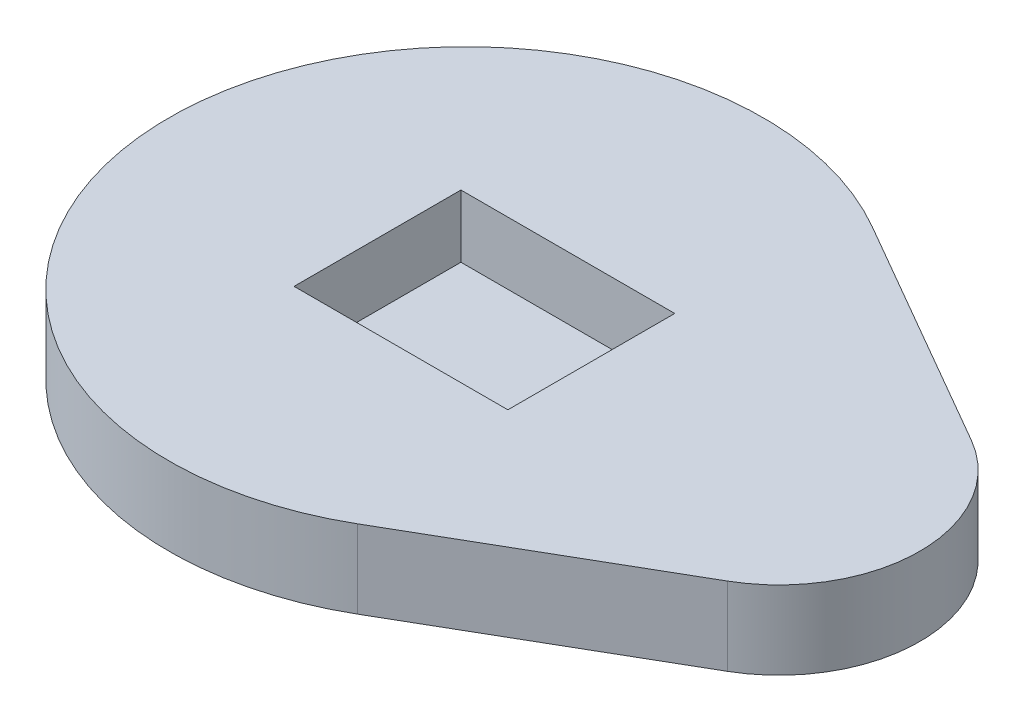
ISO-10303-21;
HEADER;
FILE_DESCRIPTION(('STEP AP214'),'2;1');
FILE_NAME('part.step','',(''),(''),'','','');
FILE_SCHEMA(('AUTOMOTIVE_DESIGN { 1 0 10303 214 1 1 1 1 }'));
ENDSEC;
DATA;
#1=APPLICATION_CONTEXT('core data for automotive mechanical design processes');
#2=APPLICATION_PROTOCOL_DEFINITION('international standard','automotive_design',2000,#1);
#3=PRODUCT_CONTEXT('',#1,'mechanical');
#4=PRODUCT('Part','Part','',(#3));
#5=PRODUCT_RELATED_PRODUCT_CATEGORY('part','',(#4));
#6=PRODUCT_DEFINITION_FORMATION('','',#4);
#7=PRODUCT_DEFINITION_CONTEXT('part definition',#1,'design');
#8=PRODUCT_DEFINITION('design','',#6,#7);
#9=PRODUCT_DEFINITION_SHAPE('','',#8);
#10=(LENGTH_UNIT() NAMED_UNIT(*) SI_UNIT(.MILLI.,.METRE.));
#11=(NAMED_UNIT(*) PLANE_ANGLE_UNIT() SI_UNIT($,.RADIAN.));
#12=(NAMED_UNIT(*) SI_UNIT($,.STERADIAN.) SOLID_ANGLE_UNIT());
#13=UNCERTAINTY_MEASURE_WITH_UNIT(LENGTH_MEASURE(1.E-05),#10,'distance_accuracy_value','');
#14=(GEOMETRIC_REPRESENTATION_CONTEXT(3) GLOBAL_UNCERTAINTY_ASSIGNED_CONTEXT((#13)) GLOBAL_UNIT_ASSIGNED_CONTEXT((#10,
#11,#12)) REPRESENTATION_CONTEXT('',''));
#15=CARTESIAN_POINT('',(0.,0.,0.));
#16=DIRECTION('',(0.,0.,1.));
#17=DIRECTION('',(1.,0.,0.));
#18=AXIS2_PLACEMENT_3D('',#15,#16,#17);
#19=CARTESIAN_POINT('',(-14.999999999992,15.,2.27750893168553E-12));
#20=DIRECTION('',(0.,-1.,0.));
#21=DIRECTION('',(0.,0.,-1.));
#22=AXIS2_PLACEMENT_3D('',#19,#20,#21);
#23=CYLINDRICAL_SURFACE('',#22,56.9999999999957);
#24=CARTESIAN_POINT('',(-14.999999999992,0.,2.27750893168553E-12));
#25=DIRECTION('',(0.,1.,0.));
#26=DIRECTION('',(0.,0.,1.));
#27=AXIS2_PLACEMENT_3D('',#24,#25,#26);
#28=CIRCLE('',#27,56.9999999999957);
#29=CARTESIAN_POINT('',(13.5000000000058,0.,-49.363448015707));
#30=VERTEX_POINT('',#29);
#31=CARTESIAN_POINT('',(13.5000000000058,0.,49.3634480157116));
#32=VERTEX_POINT('',#31);
#33=EDGE_CURVE('E158',#30,#32,#28,.T.);
#34=ORIENTED_EDGE('',*,*,#33,.T.);
#35=DIRECTION('',(0.,-1.,0.));
#36=VECTOR('',#35,1.);
#37=CARTESIAN_POINT('',(13.5000000000058,15.,49.3634480157116));
#38=LINE('',#37,#36);
#39=CARTESIAN_POINT('',(13.5000000000058,15.,49.3634480157116));
#40=VERTEX_POINT('',#39);
#41=EDGE_CURVE('E11',#40,#32,#38,.T.);
#42=ORIENTED_EDGE('',*,*,#41,.F.);
#43=CARTESIAN_POINT('',(-14.999999999992,15.,2.27750893168553E-12));
#44=DIRECTION('',(0.,1.,0.));
#45=DIRECTION('',(0.,0.,1.));
#46=AXIS2_PLACEMENT_3D('',#43,#44,#45);
#47=CIRCLE('',#46,56.9999999999957);
#48=CARTESIAN_POINT('',(13.5000000000058,15.,-49.363448015707));
#49=VERTEX_POINT('',#48);
#50=EDGE_CURVE('E164',#49,#40,#47,.T.);
#51=ORIENTED_EDGE('',*,*,#50,.F.);
#52=DIRECTION('',(0.,-1.,0.));
#53=VECTOR('',#52,1.);
#54=CARTESIAN_POINT('',(13.5000000000058,15.,-49.363448015707));
#55=LINE('',#54,#53);
#56=EDGE_CURVE('E174',#49,#30,#55,.T.);
#57=ORIENTED_EDGE('',*,*,#56,.T.);
#58=EDGE_LOOP('',(#34,#42,#51,#57));
#59=FACE_BOUND('',#58,.T.);
#60=ADVANCED_FACE('F39',(#59),#23,.T.);
#61=CARTESIAN_POINT('',(13.5000000000058,15.,49.3634480157116));
#62=DIRECTION('',(-0.5,0.,-0.866025403784438));
#63=DIRECTION('',(-0.866025403784439,0.,0.5));
#64=AXIS2_PLACEMENT_3D('',#61,#62,#63);
#65=PLANE('',#64);
#66=DIRECTION('',(0.866025403784439,0.,-0.5));
#67=VECTOR('',#66,1.);
#68=CARTESIAN_POINT('',(13.5000000000058,0.,49.3634480157116));
#69=LINE('',#68,#67);
#70=CARTESIAN_POINT('',(58.499999997785,0.,23.3826859034606));
#71=VERTEX_POINT('',#70);
#72=EDGE_CURVE('E178',#32,#71,#69,.T.);
#73=ORIENTED_EDGE('',*,*,#72,.T.);
#74=DIRECTION('',(0.,-1.,0.));
#75=VECTOR('',#74,1.);
#76=CARTESIAN_POINT('',(58.499999997785,15.,23.3826859034606));
#77=LINE('',#76,#75);
#78=CARTESIAN_POINT('',(58.499999997785,15.,23.3826859034606));
#79=VERTEX_POINT('',#78);
#80=EDGE_CURVE('E47',#79,#71,#77,.T.);
#81=ORIENTED_EDGE('',*,*,#80,.F.);
#82=DIRECTION('',(0.866025403784439,0.,-0.5));
#83=VECTOR('',#82,1.);
#84=CARTESIAN_POINT('',(13.5000000000058,15.,49.3634480157116));
#85=LINE('',#84,#83);
#86=EDGE_CURVE('E91',#40,#79,#85,.T.);
#87=ORIENTED_EDGE('',*,*,#86,.F.);
#88=ORIENTED_EDGE('',*,*,#41,.T.);
#89=EDGE_LOOP('',(#73,#81,#87,#88));
#90=FACE_BOUND('',#89,.T.);
#91=ADVANCED_FACE('F213',(#90),#65,.F.);
#92=CARTESIAN_POINT('',(44.9999999970469,15.,2.27192763023602E-12));
#93=DIRECTION('',(0.,-1.,0.));
#94=DIRECTION('',(0.,0.,-1.));
#95=AXIS2_PLACEMENT_3D('',#92,#93,#94);
#96=CYLINDRICAL_SURFACE('',#95,27.0000000014763);
#97=CARTESIAN_POINT('',(44.9999999970469,0.,2.27192763023602E-12));
#98=DIRECTION('',(0.,1.,0.));
#99=DIRECTION('',(0.,0.,-1.));
#100=AXIS2_PLACEMENT_3D('',#97,#98,#99);
#101=CIRCLE('',#100,27.0000000014763);
#102=CARTESIAN_POINT('',(58.499999997785,0.,-23.382685903456));
#103=VERTEX_POINT('',#102);
#104=EDGE_CURVE('E181',#71,#103,#101,.T.);
#105=ORIENTED_EDGE('',*,*,#104,.T.);
#106=DIRECTION('',(0.,-1.,0.));
#107=VECTOR('',#106,1.);
#108=CARTESIAN_POINT('',(58.499999997785,15.,-23.382685903456));
#109=LINE('',#108,#107);
#110=CARTESIAN_POINT('',(58.499999997785,15.,-23.382685903456));
#111=VERTEX_POINT('',#110);
#112=EDGE_CURVE('E188',#111,#103,#109,.T.);
#113=ORIENTED_EDGE('',*,*,#112,.F.);
#114=CARTESIAN_POINT('',(44.9999999970469,15.,2.27192763023602E-12));
#115=DIRECTION('',(0.,1.,0.));
#116=DIRECTION('',(0.,0.,-1.));
#117=AXIS2_PLACEMENT_3D('',#114,#115,#116);
#118=CIRCLE('',#117,27.0000000014763);
#119=EDGE_CURVE('E169',#79,#111,#118,.T.);
#120=ORIENTED_EDGE('',*,*,#119,.F.);
#121=ORIENTED_EDGE('',*,*,#80,.T.);
#122=EDGE_LOOP('',(#105,#113,#120,#121));
#123=FACE_BOUND('',#122,.T.);
#124=ADVANCED_FACE('F195',(#123),#96,.T.);
#125=CARTESIAN_POINT('',(13.5000000000058,15.,-49.363448015707));
#126=DIRECTION('',(-0.5,0.,0.866025403784439));
#127=DIRECTION('',(0.866025403784439,0.,0.5));
#128=AXIS2_PLACEMENT_3D('',#125,#126,#127);
#129=PLANE('',#128);
#130=DIRECTION('',(-0.866025403784439,0.,-0.5));
#131=VECTOR('',#130,1.);
#132=CARTESIAN_POINT('',(13.5000000000058,0.,-49.363448015707));
#133=LINE('',#132,#131);
#134=EDGE_CURVE('E84',#103,#30,#133,.T.);
#135=ORIENTED_EDGE('',*,*,#134,.T.);
#136=ORIENTED_EDGE('',*,*,#56,.F.);
#137=DIRECTION('',(-0.866025403784439,0.,-0.5));
#138=VECTOR('',#137,1.);
#139=CARTESIAN_POINT('',(13.5000000000058,15.,-49.363448015707));
#140=LINE('',#139,#138);
#141=EDGE_CURVE('E63',#111,#49,#140,.T.);
#142=ORIENTED_EDGE('',*,*,#141,.F.);
#143=ORIENTED_EDGE('',*,*,#112,.T.);
#144=EDGE_LOOP('',(#135,#136,#142,#143));
#145=FACE_BOUND('',#144,.T.);
#146=ADVANCED_FACE('F203',(#145),#129,.F.);
#147=CARTESIAN_POINT('',(-14.999999999992,15.,2.27750893168553E-12));
#148=DIRECTION('',(0.,1.,0.));
#149=DIRECTION('',(0.,0.,1.));
#150=AXIS2_PLACEMENT_3D('',#147,#148,#149);
#151=PLANE('',#150);
#152=DIRECTION('',(-1.,0.,0.));
#153=VECTOR('',#152,1.);
#154=CARTESIAN_POINT('',(-31.999999999992,15.,-16.));
#155=LINE('',#154,#153);
#156=CARTESIAN_POINT('',(9.00000000000798,15.,-16.));
#157=VERTEX_POINT('',#156);
#158=CARTESIAN_POINT('',(-31.999999999992,15.,-16.));
#159=VERTEX_POINT('',#158);
#160=EDGE_CURVE('E54',#157,#159,#155,.T.);
#161=ORIENTED_EDGE('',*,*,#160,.F.);
#162=DIRECTION('',(0.,0.,-1.));
#163=VECTOR('',#162,1.);
#164=CARTESIAN_POINT('',(9.00000000000798,15.,-16.));
#165=LINE('',#164,#163);
#166=CARTESIAN_POINT('',(9.00000000000798,15.,16.));
#167=VERTEX_POINT('',#166);
#168=EDGE_CURVE('E136',#167,#157,#165,.T.);
#169=ORIENTED_EDGE('',*,*,#168,.F.);
#170=DIRECTION('',(1.,0.,0.));
#171=VECTOR('',#170,1.);
#172=CARTESIAN_POINT('',(9.00000000000798,15.,16.));
#173=LINE('',#172,#171);
#174=CARTESIAN_POINT('',(-31.999999999992,15.,16.));
#175=VERTEX_POINT('',#174);
#176=EDGE_CURVE('E140',#175,#167,#173,.T.);
#177=ORIENTED_EDGE('',*,*,#176,.F.);
#178=DIRECTION('',(0.,0.,1.));
#179=VECTOR('',#178,1.);
#180=CARTESIAN_POINT('',(-31.999999999992,15.,16.));
#181=LINE('',#180,#179);
#182=EDGE_CURVE('E149',#159,#175,#181,.T.);
#183=ORIENTED_EDGE('',*,*,#182,.F.);
#184=EDGE_LOOP('',(#161,#169,#177,#183));
#185=FACE_BOUND('',#184,.T.);
#186=ORIENTED_EDGE('',*,*,#50,.T.);
#187=ORIENTED_EDGE('',*,*,#86,.T.);
#188=ORIENTED_EDGE('',*,*,#119,.T.);
#189=ORIENTED_EDGE('',*,*,#141,.T.);
#190=EDGE_LOOP('',(#186,#187,#188,#189));
#191=FACE_BOUND('',#190,.T.);
#192=ADVANCED_FACE('F205',(#185,#191),#151,.T.);
#193=CARTESIAN_POINT('',(-14.999999999992,0.,2.27750893168553E-12));
#194=DIRECTION('',(0.,1.,0.));
#195=DIRECTION('',(0.,0.,1.));
#196=AXIS2_PLACEMENT_3D('',#193,#194,#195);
#197=PLANE('',#196);
#198=ORIENTED_EDGE('',*,*,#33,.F.);
#199=ORIENTED_EDGE('',*,*,#134,.F.);
#200=ORIENTED_EDGE('',*,*,#104,.F.);
#201=ORIENTED_EDGE('',*,*,#72,.F.);
#202=EDGE_LOOP('',(#198,#199,#200,#201));
#203=FACE_BOUND('',#202,.T.);
#204=ADVANCED_FACE('F199',(#203),#197,.F.);
#205=CARTESIAN_POINT('',(-31.999999999992,3.,-16.));
#206=DIRECTION('',(0.,0.,-1.));
#207=DIRECTION('',(-1.,0.,0.));
#208=AXIS2_PLACEMENT_3D('',#205,#206,#207);
#209=PLANE('',#208);
#210=ORIENTED_EDGE('',*,*,#160,.T.);
#211=DIRECTION('',(0.,1.,0.));
#212=VECTOR('',#211,1.);
#213=CARTESIAN_POINT('',(-31.999999999992,3.,-16.));
#214=LINE('',#213,#212);
#215=CARTESIAN_POINT('',(-31.999999999992,3.,-16.));
#216=VERTEX_POINT('',#215);
#217=EDGE_CURVE('E111',#216,#159,#214,.T.);
#218=ORIENTED_EDGE('',*,*,#217,.F.);
#219=DIRECTION('',(-1.,0.,0.));
#220=VECTOR('',#219,1.);
#221=CARTESIAN_POINT('',(-31.999999999992,3.,-16.));
#222=LINE('',#221,#220);
#223=CARTESIAN_POINT('',(9.00000000000798,3.,-16.));
#224=VERTEX_POINT('',#223);
#225=EDGE_CURVE('E115',#224,#216,#222,.T.);
#226=ORIENTED_EDGE('',*,*,#225,.F.);
#227=DIRECTION('',(0.,1.,0.));
#228=VECTOR('',#227,1.);
#229=CARTESIAN_POINT('',(9.00000000000798,3.,-16.));
#230=LINE('',#229,#228);
#231=EDGE_CURVE('E155',#224,#157,#230,.T.);
#232=ORIENTED_EDGE('',*,*,#231,.T.);
#233=EDGE_LOOP('',(#210,#218,#226,#232));
#234=FACE_BOUND('',#233,.T.);
#235=ADVANCED_FACE('F113',(#234),#209,.F.);
#236=CARTESIAN_POINT('',(9.00000000000798,3.,-16.));
#237=DIRECTION('',(1.,0.,0.));
#238=DIRECTION('',(0.,0.,-1.));
#239=AXIS2_PLACEMENT_3D('',#236,#237,#238);
#240=PLANE('',#239);
#241=ORIENTED_EDGE('',*,*,#168,.T.);
#242=ORIENTED_EDGE('',*,*,#231,.F.);
#243=DIRECTION('',(0.,0.,-1.));
#244=VECTOR('',#243,1.);
#245=CARTESIAN_POINT('',(9.00000000000798,3.,-16.));
#246=LINE('',#245,#244);
#247=CARTESIAN_POINT('',(9.00000000000798,3.,16.));
#248=VERTEX_POINT('',#247);
#249=EDGE_CURVE('E122',#248,#224,#246,.T.);
#250=ORIENTED_EDGE('',*,*,#249,.F.);
#251=DIRECTION('',(0.,1.,0.));
#252=VECTOR('',#251,1.);
#253=CARTESIAN_POINT('',(9.00000000000798,3.,16.));
#254=LINE('',#253,#252);
#255=EDGE_CURVE('E159',#248,#167,#254,.T.);
#256=ORIENTED_EDGE('',*,*,#255,.T.);
#257=EDGE_LOOP('',(#241,#242,#250,#256));
#258=FACE_BOUND('',#257,.T.);
#259=ADVANCED_FACE('F252',(#258),#240,.F.);
#260=CARTESIAN_POINT('',(9.00000000000798,3.,16.));
#261=DIRECTION('',(0.,0.,1.));
#262=DIRECTION('',(1.,0.,0.));
#263=AXIS2_PLACEMENT_3D('',#260,#261,#262);
#264=PLANE('',#263);
#265=ORIENTED_EDGE('',*,*,#176,.T.);
#266=ORIENTED_EDGE('',*,*,#255,.F.);
#267=DIRECTION('',(1.,0.,0.));
#268=VECTOR('',#267,1.);
#269=CARTESIAN_POINT('',(9.00000000000798,3.,16.));
#270=LINE('',#269,#268);
#271=CARTESIAN_POINT('',(-31.999999999992,3.,16.));
#272=VERTEX_POINT('',#271);
#273=EDGE_CURVE('E131',#272,#248,#270,.T.);
#274=ORIENTED_EDGE('',*,*,#273,.F.);
#275=DIRECTION('',(0.,1.,0.));
#276=VECTOR('',#275,1.);
#277=CARTESIAN_POINT('',(-31.999999999992,3.,16.));
#278=LINE('',#277,#276);
#279=EDGE_CURVE('E121',#272,#175,#278,.T.);
#280=ORIENTED_EDGE('',*,*,#279,.T.);
#281=EDGE_LOOP('',(#265,#266,#274,#280));
#282=FACE_BOUND('',#281,.T.);
#283=ADVANCED_FACE('F261',(#282),#264,.F.);
#284=CARTESIAN_POINT('',(-31.999999999992,3.,16.));
#285=DIRECTION('',(-1.,0.,0.));
#286=DIRECTION('',(0.,0.,1.));
#287=AXIS2_PLACEMENT_3D('',#284,#285,#286);
#288=PLANE('',#287);
#289=ORIENTED_EDGE('',*,*,#182,.T.);
#290=ORIENTED_EDGE('',*,*,#279,.F.);
#291=DIRECTION('',(0.,0.,1.));
#292=VECTOR('',#291,1.);
#293=CARTESIAN_POINT('',(-31.999999999992,3.,16.));
#294=LINE('',#293,#292);
#295=EDGE_CURVE('E125',#216,#272,#294,.T.);
#296=ORIENTED_EDGE('',*,*,#295,.F.);
#297=ORIENTED_EDGE('',*,*,#217,.T.);
#298=EDGE_LOOP('',(#289,#290,#296,#297));
#299=FACE_BOUND('',#298,.T.);
#300=ADVANCED_FACE('F126',(#299),#288,.F.);
#301=CARTESIAN_POINT('',(0.,3.,0.));
#302=DIRECTION('',(0.,-1.,0.));
#303=DIRECTION('',(0.,0.,-1.));
#304=AXIS2_PLACEMENT_3D('',#301,#302,#303);
#305=PLANE('',#304);
#306=ORIENTED_EDGE('',*,*,#225,.T.);
#307=ORIENTED_EDGE('',*,*,#295,.T.);
#308=ORIENTED_EDGE('',*,*,#273,.T.);
#309=ORIENTED_EDGE('',*,*,#249,.T.);
#310=EDGE_LOOP('',(#306,#307,#308,#309));
#311=FACE_BOUND('',#310,.T.);
#312=ADVANCED_FACE('F133',(#311),#305,.F.);
#313=CLOSED_SHELL('',(#60,#91,#124,#146,#192,#204,#235,#259,#283,#300,#312));
#314=MANIFOLD_SOLID_BREP('B2',#313);
#315=ADVANCED_BREP_SHAPE_REPRESENTATION('',(#18,#314),#14);
#316=SHAPE_DEFINITION_REPRESENTATION(#9,#315);
ENDSEC;
END-ISO-10303-21;
